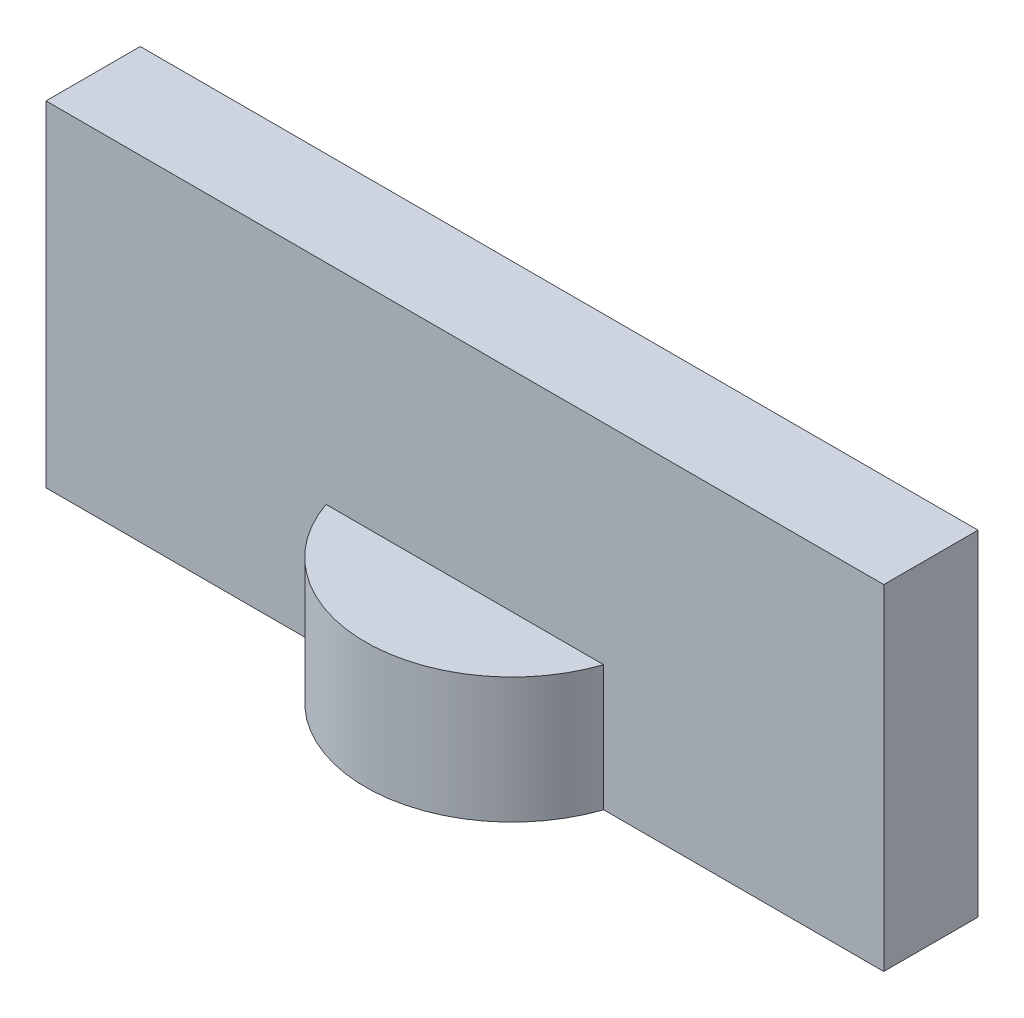
ISO-10303-21;
HEADER;
FILE_DESCRIPTION(('STEP AP214'),'2;1');
FILE_NAME('part.step','',(''),(''),'','','');
FILE_SCHEMA(('AUTOMOTIVE_DESIGN { 1 0 10303 214 1 1 1 1 }'));
ENDSEC;
DATA;
#1=APPLICATION_CONTEXT('core data for automotive mechanical design processes');
#2=APPLICATION_PROTOCOL_DEFINITION('international standard','automotive_design',2000,#1);
#3=PRODUCT_CONTEXT('',#1,'mechanical');
#4=PRODUCT('Part','Part','',(#3));
#5=PRODUCT_RELATED_PRODUCT_CATEGORY('part','',(#4));
#6=PRODUCT_DEFINITION_FORMATION('','',#4);
#7=PRODUCT_DEFINITION_CONTEXT('part definition',#1,'design');
#8=PRODUCT_DEFINITION('design','',#6,#7);
#9=PRODUCT_DEFINITION_SHAPE('','',#8);
#10=(LENGTH_UNIT() NAMED_UNIT(*) SI_UNIT(.MILLI.,.METRE.));
#11=(NAMED_UNIT(*) PLANE_ANGLE_UNIT() SI_UNIT($,.RADIAN.));
#12=(NAMED_UNIT(*) SI_UNIT($,.STERADIAN.) SOLID_ANGLE_UNIT());
#13=UNCERTAINTY_MEASURE_WITH_UNIT(LENGTH_MEASURE(1.E-05),#10,'distance_accuracy_value','');
#14=(GEOMETRIC_REPRESENTATION_CONTEXT(3) GLOBAL_UNCERTAINTY_ASSIGNED_CONTEXT((#13)) GLOBAL_UNIT_ASSIGNED_CONTEXT((#10,
#11,#12)) REPRESENTATION_CONTEXT('',''));
#15=CARTESIAN_POINT('',(0.,0.,0.));
#16=DIRECTION('',(0.,0.,1.));
#17=DIRECTION('',(1.,0.,0.));
#18=AXIS2_PLACEMENT_3D('',#15,#16,#17);
#19=CARTESIAN_POINT('',(0.,3.81,0.));
#20=DIRECTION('',(0.,-1.,0.));
#21=DIRECTION('',(0.,0.,-1.));
#22=AXIS2_PLACEMENT_3D('',#19,#20,#21);
#23=CYLINDRICAL_SURFACE('',#22,4.445);
#24=DIRECTION('',(0.,-1.,0.));
#25=VECTOR('',#24,1.);
#26=CARTESIAN_POINT('',(4.2091208627812,3.81,1.42875));
#27=LINE('',#26,#25);
#28=CARTESIAN_POINT('',(4.2091208627812,3.81,1.42875));
#29=VERTEX_POINT('',#28);
#30=CARTESIAN_POINT('',(4.2091208627812,0.,1.42875));
#31=VERTEX_POINT('',#30);
#32=EDGE_CURVE('E135',#29,#31,#27,.T.);
#33=ORIENTED_EDGE('',*,*,#32,.F.);
#34=CARTESIAN_POINT('',(0.,3.81,0.));
#35=DIRECTION('',(0.,1.,0.));
#36=DIRECTION('',(0.,0.,1.));
#37=AXIS2_PLACEMENT_3D('',#34,#35,#36);
#38=CIRCLE('',#37,4.445);
#39=CARTESIAN_POINT('',(-4.2091208627812,3.81,1.42875));
#40=VERTEX_POINT('',#39);
#41=EDGE_CURVE('E41',#40,#29,#38,.T.);
#42=ORIENTED_EDGE('',*,*,#41,.F.);
#43=DIRECTION('',(0.,-1.,0.));
#44=VECTOR('',#43,1.);
#45=CARTESIAN_POINT('',(-4.2091208627812,3.81,1.42875));
#46=LINE('',#45,#44);
#47=CARTESIAN_POINT('',(-4.2091208627812,0.,1.42875));
#48=VERTEX_POINT('',#47);
#49=EDGE_CURVE('E56',#48,#40,#46,.F.);
#50=ORIENTED_EDGE('',*,*,#49,.F.);
#51=CARTESIAN_POINT('',(0.,0.,0.));
#52=DIRECTION('',(0.,1.,0.));
#53=DIRECTION('',(0.,0.,1.));
#54=AXIS2_PLACEMENT_3D('',#51,#52,#53);
#55=CIRCLE('',#54,4.445);
#56=EDGE_CURVE('E36',#48,#31,#55,.T.);
#57=ORIENTED_EDGE('',*,*,#56,.T.);
#58=EDGE_LOOP('',(#33,#42,#50,#57));
#59=FACE_BOUND('',#58,.T.);
#60=ADVANCED_FACE('F33',(#59),#23,.T.);
#61=DIRECTION('',(0.,-1.,0.));
#62=VECTOR('',#61,1.);
#63=CARTESIAN_POINT('',(-4.2091208627812,3.81,-1.42875));
#64=LINE('',#63,#62);
#65=CARTESIAN_POINT('',(-4.20912086278121,3.81,-1.42875));
#66=VERTEX_POINT('',#65);
#67=CARTESIAN_POINT('',(-4.20912086278121,0.,-1.42875));
#68=VERTEX_POINT('',#67);
#69=EDGE_CURVE('E130',#66,#68,#64,.T.);
#70=ORIENTED_EDGE('',*,*,#69,.F.);
#71=CARTESIAN_POINT('',(4.20912086278121,3.81,-1.42875));
#72=VERTEX_POINT('',#71);
#73=EDGE_CURVE('E11',#72,#66,#38,.T.);
#74=ORIENTED_EDGE('',*,*,#73,.F.);
#75=DIRECTION('',(0.,-1.,0.));
#76=VECTOR('',#75,1.);
#77=CARTESIAN_POINT('',(4.2091208627812,3.81,-1.42875));
#78=LINE('',#77,#76);
#79=CARTESIAN_POINT('',(4.20912086278121,0.,-1.42875));
#80=VERTEX_POINT('',#79);
#81=EDGE_CURVE('E48',#80,#72,#78,.F.);
#82=ORIENTED_EDGE('',*,*,#81,.F.);
#83=EDGE_CURVE('E137',#80,#68,#55,.T.);
#84=ORIENTED_EDGE('',*,*,#83,.T.);
#85=EDGE_LOOP('',(#70,#74,#82,#84));
#86=FACE_BOUND('',#85,.T.);
#87=ADVANCED_FACE('F170',(#86),#23,.T.);
#88=CARTESIAN_POINT('',(0.,3.81,0.));
#89=DIRECTION('',(0.,1.,0.));
#90=DIRECTION('',(0.,0.,1.));
#91=AXIS2_PLACEMENT_3D('',#88,#89,#90);
#92=PLANE('',#91);
#93=ORIENTED_EDGE('',*,*,#41,.T.);
#94=DIRECTION('',(-1.,0.,0.));
#95=VECTOR('',#94,1.);
#96=CARTESIAN_POINT('',(0.,3.81,1.42875));
#97=LINE('',#96,#95);
#98=EDGE_CURVE('E132',#29,#40,#97,.T.);
#99=ORIENTED_EDGE('',*,*,#98,.T.);
#100=EDGE_LOOP('',(#93,#99));
#101=FACE_BOUND('',#100,.T.);
#102=ADVANCED_FACE('F174',(#101),#92,.T.);
#103=ORIENTED_EDGE('',*,*,#73,.T.);
#104=DIRECTION('',(1.,0.,0.));
#105=VECTOR('',#104,1.);
#106=CARTESIAN_POINT('',(0.,3.81,-1.42875));
#107=LINE('',#106,#105);
#108=EDGE_CURVE('E122',#66,#72,#107,.T.);
#109=ORIENTED_EDGE('',*,*,#108,.T.);
#110=EDGE_LOOP('',(#103,#109));
#111=FACE_BOUND('',#110,.T.);
#112=ADVANCED_FACE('F172',(#111),#92,.T.);
#113=CARTESIAN_POINT('',(0.,0.,0.));
#114=DIRECTION('',(0.,1.,0.));
#115=DIRECTION('',(0.,0.,1.));
#116=AXIS2_PLACEMENT_3D('',#113,#114,#115);
#117=PLANE('',#116);
#118=ORIENTED_EDGE('',*,*,#83,.F.);
#119=DIRECTION('',(-1.,0.,0.));
#120=VECTOR('',#119,1.);
#121=CARTESIAN_POINT('',(12.7,0.,-1.42875));
#122=LINE('',#121,#120);
#123=CARTESIAN_POINT('',(12.7,0.,-1.42875));
#124=VERTEX_POINT('',#123);
#125=EDGE_CURVE('E117',#124,#80,#122,.T.);
#126=ORIENTED_EDGE('',*,*,#125,.F.);
#127=DIRECTION('',(0.,0.,-1.));
#128=VECTOR('',#127,1.);
#129=CARTESIAN_POINT('',(12.7,0.,1.42875));
#130=LINE('',#129,#128);
#131=CARTESIAN_POINT('',(12.7,0.,1.42875));
#132=VERTEX_POINT('',#131);
#133=EDGE_CURVE('E155',#132,#124,#130,.T.);
#134=ORIENTED_EDGE('',*,*,#133,.F.);
#135=DIRECTION('',(1.,0.,0.));
#136=VECTOR('',#135,1.);
#137=CARTESIAN_POINT('',(12.7,0.,1.42875));
#138=LINE('',#137,#136);
#139=EDGE_CURVE('E153',#31,#132,#138,.T.);
#140=ORIENTED_EDGE('',*,*,#139,.F.);
#141=ORIENTED_EDGE('',*,*,#56,.F.);
#142=CARTESIAN_POINT('',(-12.7,0.,1.42875));
#143=VERTEX_POINT('',#142);
#144=EDGE_CURVE('E151',#143,#48,#138,.T.);
#145=ORIENTED_EDGE('',*,*,#144,.F.);
#146=DIRECTION('',(0.,0.,1.));
#147=VECTOR('',#146,1.);
#148=CARTESIAN_POINT('',(-12.7,0.,1.42875));
#149=LINE('',#148,#147);
#150=CARTESIAN_POINT('',(-12.7,0.,-1.42875));
#151=VERTEX_POINT('',#150);
#152=EDGE_CURVE('E121',#151,#143,#149,.T.);
#153=ORIENTED_EDGE('',*,*,#152,.F.);
#154=EDGE_CURVE('E161',#68,#151,#122,.T.);
#155=ORIENTED_EDGE('',*,*,#154,.F.);
#156=EDGE_LOOP('',(#118,#126,#134,#140,#141,#145,#153,#155));
#157=FACE_BOUND('',#156,.T.);
#158=ADVANCED_FACE('F150',(#157),#117,.F.);
#159=CARTESIAN_POINT('',(12.7,10.16,1.42875));
#160=DIRECTION('',(0.,0.,-1.));
#161=DIRECTION('',(-1.,0.,0.));
#162=AXIS2_PLACEMENT_3D('',#159,#160,#161);
#163=PLANE('',#162);
#164=ORIENTED_EDGE('',*,*,#98,.F.);
#165=ORIENTED_EDGE('',*,*,#32,.T.);
#166=ORIENTED_EDGE('',*,*,#139,.T.);
#167=DIRECTION('',(0.,-1.,0.));
#168=VECTOR('',#167,1.);
#169=CARTESIAN_POINT('',(12.7,10.16,1.42875));
#170=LINE('',#169,#168);
#171=CARTESIAN_POINT('',(12.7,10.16,1.42875));
#172=VERTEX_POINT('',#171);
#173=EDGE_CURVE('E104',#172,#132,#170,.T.);
#174=ORIENTED_EDGE('',*,*,#173,.F.);
#175=DIRECTION('',(1.,0.,0.));
#176=VECTOR('',#175,1.);
#177=CARTESIAN_POINT('',(12.7,10.16,1.42875));
#178=LINE('',#177,#176);
#179=CARTESIAN_POINT('',(-12.7,10.16,1.42875));
#180=VERTEX_POINT('',#179);
#181=EDGE_CURVE('E97',#180,#172,#178,.T.);
#182=ORIENTED_EDGE('',*,*,#181,.F.);
#183=DIRECTION('',(0.,-1.,0.));
#184=VECTOR('',#183,1.);
#185=CARTESIAN_POINT('',(-12.7,10.16,1.42875));
#186=LINE('',#185,#184);
#187=EDGE_CURVE('E101',#180,#143,#186,.T.);
#188=ORIENTED_EDGE('',*,*,#187,.T.);
#189=ORIENTED_EDGE('',*,*,#144,.T.);
#190=ORIENTED_EDGE('',*,*,#49,.T.);
#191=EDGE_LOOP('',(#164,#165,#166,#174,#182,#188,#189,#190));
#192=FACE_BOUND('',#191,.T.);
#193=ADVANCED_FACE('F99',(#192),#163,.F.);
#194=CARTESIAN_POINT('',(12.7,10.16,-1.42875));
#195=DIRECTION('',(0.,0.,1.));
#196=DIRECTION('',(1.,0.,0.));
#197=AXIS2_PLACEMENT_3D('',#194,#195,#196);
#198=PLANE('',#197);
#199=ORIENTED_EDGE('',*,*,#108,.F.);
#200=ORIENTED_EDGE('',*,*,#69,.T.);
#201=ORIENTED_EDGE('',*,*,#154,.T.);
#202=DIRECTION('',(0.,-1.,0.));
#203=VECTOR('',#202,1.);
#204=CARTESIAN_POINT('',(-12.7,10.16,-1.42875));
#205=LINE('',#204,#203);
#206=CARTESIAN_POINT('',(-12.7,10.16,-1.42875));
#207=VERTEX_POINT('',#206);
#208=EDGE_CURVE('E163',#207,#151,#205,.T.);
#209=ORIENTED_EDGE('',*,*,#208,.F.);
#210=DIRECTION('',(-1.,0.,0.));
#211=VECTOR('',#210,1.);
#212=CARTESIAN_POINT('',(12.7,10.16,-1.42875));
#213=LINE('',#212,#211);
#214=CARTESIAN_POINT('',(12.7,10.16,-1.42875));
#215=VERTEX_POINT('',#214);
#216=EDGE_CURVE('E113',#215,#207,#213,.T.);
#217=ORIENTED_EDGE('',*,*,#216,.F.);
#218=DIRECTION('',(0.,-1.,0.));
#219=VECTOR('',#218,1.);
#220=CARTESIAN_POINT('',(12.7,10.16,-1.42875));
#221=LINE('',#220,#219);
#222=EDGE_CURVE('E125',#215,#124,#221,.T.);
#223=ORIENTED_EDGE('',*,*,#222,.T.);
#224=ORIENTED_EDGE('',*,*,#125,.T.);
#225=ORIENTED_EDGE('',*,*,#81,.T.);
#226=EDGE_LOOP('',(#199,#200,#201,#209,#217,#223,#224,#225));
#227=FACE_BOUND('',#226,.T.);
#228=ADVANCED_FACE('F166',(#227),#198,.F.);
#229=CARTESIAN_POINT('',(-12.7,10.16,1.42875));
#230=DIRECTION('',(1.,0.,0.));
#231=DIRECTION('',(0.,0.,-1.));
#232=AXIS2_PLACEMENT_3D('',#229,#230,#231);
#233=PLANE('',#232);
#234=ORIENTED_EDGE('',*,*,#152,.T.);
#235=ORIENTED_EDGE('',*,*,#187,.F.);
#236=DIRECTION('',(0.,0.,1.));
#237=VECTOR('',#236,1.);
#238=CARTESIAN_POINT('',(-12.7,10.16,1.42875));
#239=LINE('',#238,#237);
#240=EDGE_CURVE('E108',#207,#180,#239,.T.);
#241=ORIENTED_EDGE('',*,*,#240,.F.);
#242=ORIENTED_EDGE('',*,*,#208,.T.);
#243=EDGE_LOOP('',(#234,#235,#241,#242));
#244=FACE_BOUND('',#243,.T.);
#245=ADVANCED_FACE('F119',(#244),#233,.F.);
#246=CARTESIAN_POINT('',(12.7,10.16,1.42875));
#247=DIRECTION('',(-1.,0.,0.));
#248=DIRECTION('',(0.,0.,1.));
#249=AXIS2_PLACEMENT_3D('',#246,#247,#248);
#250=PLANE('',#249);
#251=ORIENTED_EDGE('',*,*,#133,.T.);
#252=ORIENTED_EDGE('',*,*,#222,.F.);
#253=DIRECTION('',(0.,0.,-1.));
#254=VECTOR('',#253,1.);
#255=CARTESIAN_POINT('',(12.7,10.16,1.42875));
#256=LINE('',#255,#254);
#257=EDGE_CURVE('E107',#172,#215,#256,.T.);
#258=ORIENTED_EDGE('',*,*,#257,.F.);
#259=ORIENTED_EDGE('',*,*,#173,.T.);
#260=EDGE_LOOP('',(#251,#252,#258,#259));
#261=FACE_BOUND('',#260,.T.);
#262=ADVANCED_FACE('F228',(#261),#250,.F.);
#263=CARTESIAN_POINT('',(0.,10.16,0.));
#264=DIRECTION('',(0.,1.,0.));
#265=DIRECTION('',(0.,0.,1.));
#266=AXIS2_PLACEMENT_3D('',#263,#264,#265);
#267=PLANE('',#266);
#268=ORIENTED_EDGE('',*,*,#240,.T.);
#269=ORIENTED_EDGE('',*,*,#181,.T.);
#270=ORIENTED_EDGE('',*,*,#257,.T.);
#271=ORIENTED_EDGE('',*,*,#216,.T.);
#272=EDGE_LOOP('',(#268,#269,#270,#271));
#273=FACE_BOUND('',#272,.T.);
#274=ADVANCED_FACE('F111',(#273),#267,.T.);
#275=CLOSED_SHELL('',(#60,#87,#102,#112,#158,#193,#228,#245,#262,#274));
#276=MANIFOLD_SOLID_BREP('B2',#275);
#277=ADVANCED_BREP_SHAPE_REPRESENTATION('',(#18,#276),#14);
#278=SHAPE_DEFINITION_REPRESENTATION(#9,#277);
ENDSEC;
END-ISO-10303-21;
